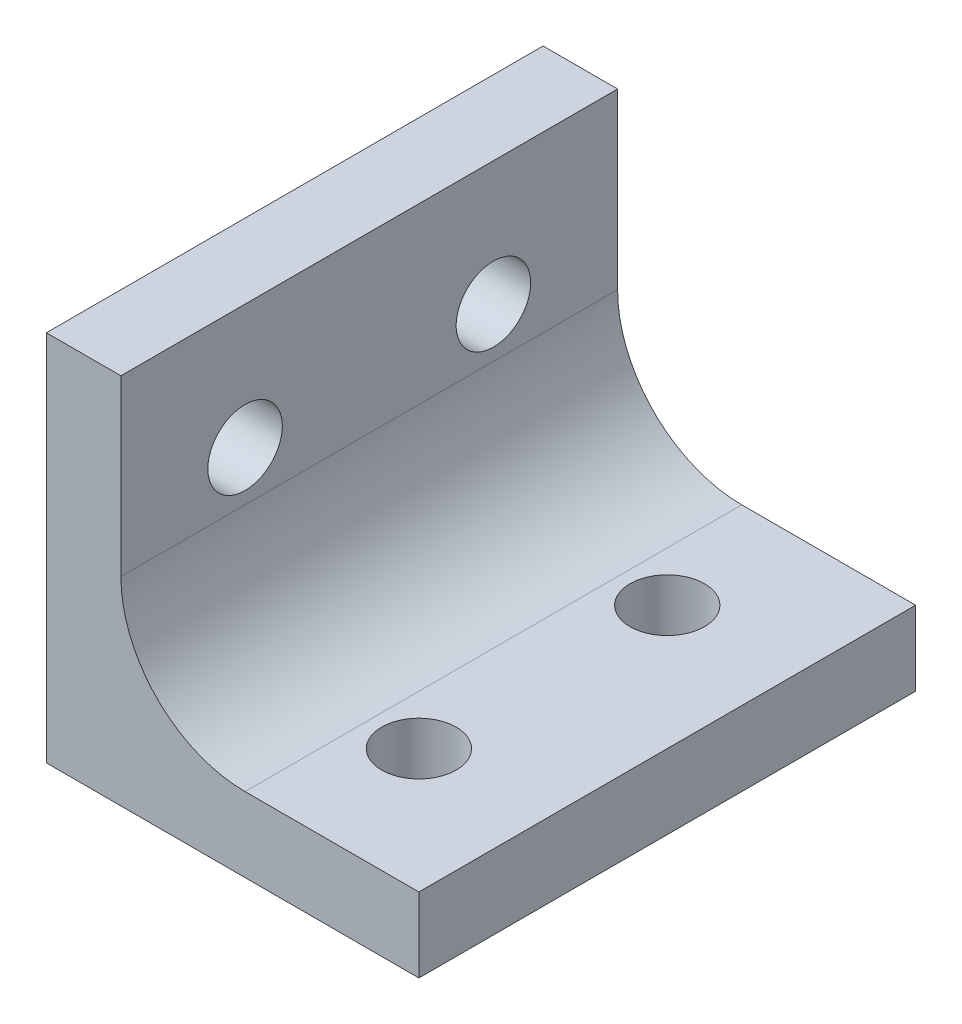
ISO-10303-21;
HEADER;
FILE_DESCRIPTION(('STEP AP214'),'2;1');
FILE_NAME('part.step','',(''),(''),'','','');
FILE_SCHEMA(('AUTOMOTIVE_DESIGN { 1 0 10303 214 1 1 1 1 }'));
ENDSEC;
DATA;
#1=APPLICATION_CONTEXT('core data for automotive mechanical design processes');
#2=APPLICATION_PROTOCOL_DEFINITION('international standard','automotive_design',2000,#1);
#3=PRODUCT_CONTEXT('',#1,'mechanical');
#4=PRODUCT('Part','Part','',(#3));
#5=PRODUCT_RELATED_PRODUCT_CATEGORY('part','',(#4));
#6=PRODUCT_DEFINITION_FORMATION('','',#4);
#7=PRODUCT_DEFINITION_CONTEXT('part definition',#1,'design');
#8=PRODUCT_DEFINITION('design','',#6,#7);
#9=PRODUCT_DEFINITION_SHAPE('','',#8);
#10=(LENGTH_UNIT() NAMED_UNIT(*) SI_UNIT(.MILLI.,.METRE.));
#11=(NAMED_UNIT(*) PLANE_ANGLE_UNIT() SI_UNIT($,.RADIAN.));
#12=(NAMED_UNIT(*) SI_UNIT($,.STERADIAN.) SOLID_ANGLE_UNIT());
#13=UNCERTAINTY_MEASURE_WITH_UNIT(LENGTH_MEASURE(1.E-05),#10,'distance_accuracy_value','');
#14=(GEOMETRIC_REPRESENTATION_CONTEXT(3) GLOBAL_UNCERTAINTY_ASSIGNED_CONTEXT((#13)) GLOBAL_UNIT_ASSIGNED_CONTEXT((#10,
#11,#12)) REPRESENTATION_CONTEXT('',''));
#15=CARTESIAN_POINT('',(0.,0.,0.));
#16=DIRECTION('',(0.,0.,1.));
#17=DIRECTION('',(1.,0.,0.));
#18=AXIS2_PLACEMENT_3D('',#15,#16,#17);
#19=CARTESIAN_POINT('',(15.,-15.,0.));
#20=DIRECTION('',(0.,0.,-1.));
#21=DIRECTION('',(-1.,0.,0.));
#22=AXIS2_PLACEMENT_3D('',#19,#20,#21);
#23=PLANE('',#22);
#24=DIRECTION('',(0.,1.,0.));
#25=VECTOR('',#24,1.);
#26=CARTESIAN_POINT('',(3.,-12.,0.));
#27=LINE('',#26,#25);
#28=CARTESIAN_POINT('',(3.,-7.,0.));
#29=VERTEX_POINT('',#28);
#30=CARTESIAN_POINT('',(3.,0.,0.));
#31=VERTEX_POINT('',#30);
#32=EDGE_CURVE('E97',#29,#31,#27,.T.);
#33=ORIENTED_EDGE('',*,*,#32,.F.);
#34=CARTESIAN_POINT('',(8.,-7.,0.));
#35=DIRECTION('',(0.,0.,-1.));
#36=DIRECTION('',(-1.,0.,0.));
#37=AXIS2_PLACEMENT_3D('',#34,#35,#36);
#38=CIRCLE('',#37,5.);
#39=CARTESIAN_POINT('',(8.,-12.,0.));
#40=VERTEX_POINT('',#39);
#41=EDGE_CURVE('E42',#29,#40,#38,.F.);
#42=ORIENTED_EDGE('',*,*,#41,.T.);
#43=DIRECTION('',(-1.,0.,0.));
#44=VECTOR('',#43,1.);
#45=CARTESIAN_POINT('',(15.,-12.,0.));
#46=LINE('',#45,#44);
#47=CARTESIAN_POINT('',(15.,-12.,0.));
#48=VERTEX_POINT('',#47);
#49=EDGE_CURVE('E134',#48,#40,#46,.T.);
#50=ORIENTED_EDGE('',*,*,#49,.F.);
#51=DIRECTION('',(0.,1.,0.));
#52=VECTOR('',#51,1.);
#53=CARTESIAN_POINT('',(15.,-15.,0.));
#54=LINE('',#53,#52);
#55=CARTESIAN_POINT('',(15.,-15.,0.));
#56=VERTEX_POINT('',#55);
#57=EDGE_CURVE('E105',#56,#48,#54,.T.);
#58=ORIENTED_EDGE('',*,*,#57,.F.);
#59=DIRECTION('',(-1.,0.,0.));
#60=VECTOR('',#59,1.);
#61=CARTESIAN_POINT('',(15.,-15.,0.));
#62=LINE('',#61,#60);
#63=CARTESIAN_POINT('',(0.,-15.,0.));
#64=VERTEX_POINT('',#63);
#65=EDGE_CURVE('E141',#56,#64,#62,.T.);
#66=ORIENTED_EDGE('',*,*,#65,.T.);
#67=DIRECTION('',(0.,1.,0.));
#68=VECTOR('',#67,1.);
#69=CARTESIAN_POINT('',(0.,-15.,0.));
#70=LINE('',#69,#68);
#71=CARTESIAN_POINT('',(0.,0.,0.));
#72=VERTEX_POINT('',#71);
#73=EDGE_CURVE('E116',#64,#72,#70,.T.);
#74=ORIENTED_EDGE('',*,*,#73,.T.);
#75=DIRECTION('',(-1.,0.,0.));
#76=VECTOR('',#75,1.);
#77=CARTESIAN_POINT('',(15.,0.,0.));
#78=LINE('',#77,#76);
#79=EDGE_CURVE('E133',#31,#72,#78,.T.);
#80=ORIENTED_EDGE('',*,*,#79,.F.);
#81=EDGE_LOOP('',(#33,#42,#50,#58,#66,#74,#80));
#82=FACE_BOUND('',#81,.T.);
#83=ADVANCED_FACE('F34',(#82),#23,.T.);
#84=CARTESIAN_POINT('',(15.,-15.,20.));
#85=DIRECTION('',(1.,0.,0.));
#86=DIRECTION('',(0.,0.,-1.));
#87=AXIS2_PLACEMENT_3D('',#84,#85,#86);
#88=PLANE('',#87);
#89=DIRECTION('',(0.,0.,-1.));
#90=VECTOR('',#89,1.);
#91=CARTESIAN_POINT('',(15.,-12.,20.));
#92=LINE('',#91,#90);
#93=CARTESIAN_POINT('',(15.,-12.,20.));
#94=VERTEX_POINT('',#93);
#95=EDGE_CURVE('E92',#94,#48,#92,.T.);
#96=ORIENTED_EDGE('',*,*,#95,.F.);
#97=DIRECTION('',(0.,1.,0.));
#98=VECTOR('',#97,1.);
#99=CARTESIAN_POINT('',(15.,-15.,20.));
#100=LINE('',#99,#98);
#101=CARTESIAN_POINT('',(15.,-15.,20.));
#102=VERTEX_POINT('',#101);
#103=EDGE_CURVE('E103',#102,#94,#100,.T.);
#104=ORIENTED_EDGE('',*,*,#103,.F.);
#105=DIRECTION('',(0.,0.,-1.));
#106=VECTOR('',#105,1.);
#107=CARTESIAN_POINT('',(15.,-15.,20.));
#108=LINE('',#107,#106);
#109=EDGE_CURVE('E122',#102,#56,#108,.T.);
#110=ORIENTED_EDGE('',*,*,#109,.T.);
#111=ORIENTED_EDGE('',*,*,#57,.T.);
#112=EDGE_LOOP('',(#96,#104,#110,#111));
#113=FACE_BOUND('',#112,.T.);
#114=ADVANCED_FACE('F101',(#113),#88,.T.);
#115=CARTESIAN_POINT('',(0.,-15.,20.));
#116=DIRECTION('',(0.,0.,1.));
#117=DIRECTION('',(1.,0.,0.));
#118=AXIS2_PLACEMENT_3D('',#115,#116,#117);
#119=PLANE('',#118);
#120=DIRECTION('',(-1.,0.,0.));
#121=VECTOR('',#120,1.);
#122=CARTESIAN_POINT('',(15.,-12.,20.));
#123=LINE('',#122,#121);
#124=CARTESIAN_POINT('',(8.,-12.,20.));
#125=VERTEX_POINT('',#124);
#126=EDGE_CURVE('E89',#94,#125,#123,.T.);
#127=ORIENTED_EDGE('',*,*,#126,.T.);
#128=CARTESIAN_POINT('',(8.,-7.,20.));
#129=DIRECTION('',(0.,0.,1.));
#130=DIRECTION('',(1.,0.,0.));
#131=AXIS2_PLACEMENT_3D('',#128,#129,#130);
#132=CIRCLE('',#131,5.);
#133=CARTESIAN_POINT('',(3.,-7.,20.));
#134=VERTEX_POINT('',#133);
#135=EDGE_CURVE('E11',#125,#134,#132,.F.);
#136=ORIENTED_EDGE('',*,*,#135,.T.);
#137=DIRECTION('',(0.,1.,0.));
#138=VECTOR('',#137,1.);
#139=CARTESIAN_POINT('',(3.,-12.,20.));
#140=LINE('',#139,#138);
#141=CARTESIAN_POINT('',(3.,0.,20.));
#142=VERTEX_POINT('',#141);
#143=EDGE_CURVE('E96',#134,#142,#140,.T.);
#144=ORIENTED_EDGE('',*,*,#143,.T.);
#145=DIRECTION('',(1.,0.,0.));
#146=VECTOR('',#145,1.);
#147=CARTESIAN_POINT('',(0.,0.,20.));
#148=LINE('',#147,#146);
#149=CARTESIAN_POINT('',(0.,0.,20.));
#150=VERTEX_POINT('',#149);
#151=EDGE_CURVE('E145',#150,#142,#148,.T.);
#152=ORIENTED_EDGE('',*,*,#151,.F.);
#153=DIRECTION('',(0.,1.,0.));
#154=VECTOR('',#153,1.);
#155=CARTESIAN_POINT('',(0.,-15.,20.));
#156=LINE('',#155,#154);
#157=CARTESIAN_POINT('',(0.,-15.,20.));
#158=VERTEX_POINT('',#157);
#159=EDGE_CURVE('E112',#158,#150,#156,.T.);
#160=ORIENTED_EDGE('',*,*,#159,.F.);
#161=DIRECTION('',(1.,0.,0.));
#162=VECTOR('',#161,1.);
#163=CARTESIAN_POINT('',(0.,-15.,20.));
#164=LINE('',#163,#162);
#165=EDGE_CURVE('E110',#158,#102,#164,.T.);
#166=ORIENTED_EDGE('',*,*,#165,.T.);
#167=ORIENTED_EDGE('',*,*,#103,.T.);
#168=EDGE_LOOP('',(#127,#136,#144,#152,#160,#166,#167));
#169=FACE_BOUND('',#168,.T.);
#170=ADVANCED_FACE('F108',(#169),#119,.T.);
#171=CARTESIAN_POINT('',(0.,-15.,0.));
#172=DIRECTION('',(-1.,0.,0.));
#173=DIRECTION('',(0.,0.,1.));
#174=AXIS2_PLACEMENT_3D('',#171,#172,#173);
#175=PLANE('',#174);
#176=CARTESIAN_POINT('',(0.,-5.,5.));
#177=DIRECTION('',(1.,0.,0.));
#178=DIRECTION('',(0.,0.,-1.));
#179=AXIS2_PLACEMENT_3D('',#176,#177,#178);
#180=CIRCLE('',#179,1.49999999999999);
#181=CARTESIAN_POINT('',(0.,-5.,3.50000000000001));
#182=VERTEX_POINT('',#181);
#183=EDGE_CURVE('E164',#182,#182,#180,.T.);
#184=ORIENTED_EDGE('',*,*,#183,.T.);
#185=EDGE_LOOP('',(#184));
#186=FACE_BOUND('',#185,.T.);
#187=CARTESIAN_POINT('',(0.,-5.,15.));
#188=DIRECTION('',(1.,0.,0.));
#189=DIRECTION('',(0.,0.,-1.));
#190=AXIS2_PLACEMENT_3D('',#187,#188,#189);
#191=CIRCLE('',#190,1.49999999999999);
#192=CARTESIAN_POINT('',(0.,-5.,13.5));
#193=VERTEX_POINT('',#192);
#194=EDGE_CURVE('E136',#193,#193,#191,.T.);
#195=ORIENTED_EDGE('',*,*,#194,.T.);
#196=EDGE_LOOP('',(#195));
#197=FACE_BOUND('',#196,.T.);
#198=DIRECTION('',(0.,0.,1.));
#199=VECTOR('',#198,1.);
#200=CARTESIAN_POINT('',(0.,0.,0.));
#201=LINE('',#200,#199);
#202=EDGE_CURVE('E151',#72,#150,#201,.T.);
#203=ORIENTED_EDGE('',*,*,#202,.F.);
#204=ORIENTED_EDGE('',*,*,#73,.F.);
#205=DIRECTION('',(0.,0.,1.));
#206=VECTOR('',#205,1.);
#207=CARTESIAN_POINT('',(0.,-15.,0.));
#208=LINE('',#207,#206);
#209=EDGE_CURVE('E144',#64,#158,#208,.T.);
#210=ORIENTED_EDGE('',*,*,#209,.T.);
#211=ORIENTED_EDGE('',*,*,#159,.T.);
#212=EDGE_LOOP('',(#203,#204,#210,#211));
#213=FACE_BOUND('',#212,.T.);
#214=ADVANCED_FACE('F211',(#186,#197,#213),#175,.T.);
#215=CARTESIAN_POINT('',(0.,-15.,0.));
#216=DIRECTION('',(0.,1.,0.));
#217=DIRECTION('',(0.,0.,1.));
#218=AXIS2_PLACEMENT_3D('',#215,#216,#217);
#219=PLANE('',#218);
#220=CARTESIAN_POINT('',(10.,-15.,5.));
#221=DIRECTION('',(0.,1.,0.));
#222=DIRECTION('',(0.,0.,1.));
#223=AXIS2_PLACEMENT_3D('',#220,#221,#222);
#224=CIRCLE('',#223,1.49999999999999);
#225=CARTESIAN_POINT('',(10.,-15.,6.49999999999999));
#226=VERTEX_POINT('',#225);
#227=EDGE_CURVE('E176',#226,#226,#224,.T.);
#228=ORIENTED_EDGE('',*,*,#227,.T.);
#229=EDGE_LOOP('',(#228));
#230=FACE_BOUND('',#229,.T.);
#231=CARTESIAN_POINT('',(10.,-15.,15.));
#232=DIRECTION('',(0.,1.,0.));
#233=DIRECTION('',(0.,0.,1.));
#234=AXIS2_PLACEMENT_3D('',#231,#232,#233);
#235=CIRCLE('',#234,1.49999999999999);
#236=CARTESIAN_POINT('',(10.,-15.,16.5));
#237=VERTEX_POINT('',#236);
#238=EDGE_CURVE('E170',#237,#237,#235,.T.);
#239=ORIENTED_EDGE('',*,*,#238,.T.);
#240=EDGE_LOOP('',(#239));
#241=FACE_BOUND('',#240,.T.);
#242=ORIENTED_EDGE('',*,*,#65,.F.);
#243=ORIENTED_EDGE('',*,*,#109,.F.);
#244=ORIENTED_EDGE('',*,*,#165,.F.);
#245=ORIENTED_EDGE('',*,*,#209,.F.);
#246=EDGE_LOOP('',(#242,#243,#244,#245));
#247=FACE_BOUND('',#246,.T.);
#248=ADVANCED_FACE('F214',(#230,#241,#247),#219,.F.);
#249=CARTESIAN_POINT('',(0.,0.,0.));
#250=DIRECTION('',(0.,1.,0.));
#251=DIRECTION('',(0.,0.,1.));
#252=AXIS2_PLACEMENT_3D('',#249,#250,#251);
#253=PLANE('',#252);
#254=DIRECTION('',(0.,0.,-1.));
#255=VECTOR('',#254,1.);
#256=CARTESIAN_POINT('',(3.,0.,20.));
#257=LINE('',#256,#255);
#258=EDGE_CURVE('E106',#142,#31,#257,.T.);
#259=ORIENTED_EDGE('',*,*,#258,.T.);
#260=ORIENTED_EDGE('',*,*,#79,.T.);
#261=ORIENTED_EDGE('',*,*,#202,.T.);
#262=ORIENTED_EDGE('',*,*,#151,.T.);
#263=EDGE_LOOP('',(#259,#260,#261,#262));
#264=FACE_BOUND('',#263,.T.);
#265=ADVANCED_FACE('F156',(#264),#253,.T.);
#266=CARTESIAN_POINT('',(3.,-12.,20.));
#267=DIRECTION('',(-1.,0.,0.));
#268=DIRECTION('',(0.,-1.,0.));
#269=AXIS2_PLACEMENT_3D('',#266,#267,#268);
#270=PLANE('',#269);
#271=CARTESIAN_POINT('',(3.,-5.,5.));
#272=DIRECTION('',(1.,0.,0.));
#273=DIRECTION('',(0.,0.,-1.));
#274=AXIS2_PLACEMENT_3D('',#271,#272,#273);
#275=CIRCLE('',#274,1.49999999999999);
#276=CARTESIAN_POINT('',(3.,-5.,3.50000000000001));
#277=VERTEX_POINT('',#276);
#278=EDGE_CURVE('E167',#277,#277,#275,.T.);
#279=ORIENTED_EDGE('',*,*,#278,.F.);
#280=EDGE_LOOP('',(#279));
#281=FACE_BOUND('',#280,.T.);
#282=CARTESIAN_POINT('',(3.,-5.,15.));
#283=DIRECTION('',(1.,0.,0.));
#284=DIRECTION('',(0.,0.,-1.));
#285=AXIS2_PLACEMENT_3D('',#282,#283,#284);
#286=CIRCLE('',#285,1.49999999999999);
#287=CARTESIAN_POINT('',(3.,-5.,13.5));
#288=VERTEX_POINT('',#287);
#289=EDGE_CURVE('E161',#288,#288,#286,.T.);
#290=ORIENTED_EDGE('',*,*,#289,.F.);
#291=EDGE_LOOP('',(#290));
#292=FACE_BOUND('',#291,.T.);
#293=ORIENTED_EDGE('',*,*,#143,.F.);
#294=DIRECTION('',(0.,0.,-1.));
#295=VECTOR('',#294,1.);
#296=CARTESIAN_POINT('',(3.,-7.,0.));
#297=LINE('',#296,#295);
#298=EDGE_CURVE('E114',#134,#29,#297,.T.);
#299=ORIENTED_EDGE('',*,*,#298,.T.);
#300=ORIENTED_EDGE('',*,*,#32,.T.);
#301=ORIENTED_EDGE('',*,*,#258,.F.);
#302=EDGE_LOOP('',(#293,#299,#300,#301));
#303=FACE_BOUND('',#302,.T.);
#304=ADVANCED_FACE('F128',(#281,#292,#303),#270,.F.);
#305=CARTESIAN_POINT('',(15.,-12.,20.));
#306=DIRECTION('',(0.,-1.,0.));
#307=DIRECTION('',(0.,0.,-1.));
#308=AXIS2_PLACEMENT_3D('',#305,#306,#307);
#309=PLANE('',#308);
#310=CARTESIAN_POINT('',(10.,-12.,5.));
#311=DIRECTION('',(0.,1.,0.));
#312=DIRECTION('',(0.,0.,1.));
#313=AXIS2_PLACEMENT_3D('',#310,#311,#312);
#314=CIRCLE('',#313,1.49999999999999);
#315=CARTESIAN_POINT('',(10.,-12.,6.49999999999999));
#316=VERTEX_POINT('',#315);
#317=EDGE_CURVE('E179',#316,#316,#314,.T.);
#318=ORIENTED_EDGE('',*,*,#317,.F.);
#319=EDGE_LOOP('',(#318));
#320=FACE_BOUND('',#319,.T.);
#321=CARTESIAN_POINT('',(10.,-12.,15.));
#322=DIRECTION('',(0.,1.,0.));
#323=DIRECTION('',(0.,0.,1.));
#324=AXIS2_PLACEMENT_3D('',#321,#322,#323);
#325=CIRCLE('',#324,1.49999999999999);
#326=CARTESIAN_POINT('',(10.,-12.,16.5));
#327=VERTEX_POINT('',#326);
#328=EDGE_CURVE('E173',#327,#327,#325,.T.);
#329=ORIENTED_EDGE('',*,*,#328,.F.);
#330=EDGE_LOOP('',(#329));
#331=FACE_BOUND('',#330,.T.);
#332=ORIENTED_EDGE('',*,*,#49,.T.);
#333=DIRECTION('',(0.,0.,-1.));
#334=VECTOR('',#333,1.);
#335=CARTESIAN_POINT('',(8.,-12.,20.));
#336=LINE('',#335,#334);
#337=EDGE_CURVE('E49',#40,#125,#336,.F.);
#338=ORIENTED_EDGE('',*,*,#337,.T.);
#339=ORIENTED_EDGE('',*,*,#126,.F.);
#340=ORIENTED_EDGE('',*,*,#95,.T.);
#341=EDGE_LOOP('',(#332,#338,#339,#340));
#342=FACE_BOUND('',#341,.T.);
#343=ADVANCED_FACE('F91',(#320,#331,#342),#309,.F.);
#344=CARTESIAN_POINT('',(3.,-5.,15.));
#345=DIRECTION('',(1.,0.,0.));
#346=DIRECTION('',(0.,0.,-1.));
#347=AXIS2_PLACEMENT_3D('',#344,#345,#346);
#348=CYLINDRICAL_SURFACE('',#347,1.49999999999999);
#349=ORIENTED_EDGE('',*,*,#194,.F.);
#350=EDGE_LOOP('',(#349));
#351=FACE_BOUND('',#350,.T.);
#352=ORIENTED_EDGE('',*,*,#289,.T.);
#353=EDGE_LOOP('',(#352));
#354=FACE_BOUND('',#353,.T.);
#355=ADVANCED_FACE('F187',(#351,#354),#348,.F.);
#356=CARTESIAN_POINT('',(3.,-5.,5.));
#357=DIRECTION('',(1.,0.,0.));
#358=DIRECTION('',(0.,0.,-1.));
#359=AXIS2_PLACEMENT_3D('',#356,#357,#358);
#360=CYLINDRICAL_SURFACE('',#359,1.49999999999999);
#361=ORIENTED_EDGE('',*,*,#183,.F.);
#362=EDGE_LOOP('',(#361));
#363=FACE_BOUND('',#362,.T.);
#364=ORIENTED_EDGE('',*,*,#278,.T.);
#365=EDGE_LOOP('',(#364));
#366=FACE_BOUND('',#365,.T.);
#367=ADVANCED_FACE('F193',(#363,#366),#360,.F.);
#368=CARTESIAN_POINT('',(10.,-12.,15.));
#369=DIRECTION('',(0.,1.,0.));
#370=DIRECTION('',(0.,0.,1.));
#371=AXIS2_PLACEMENT_3D('',#368,#369,#370);
#372=CYLINDRICAL_SURFACE('',#371,1.49999999999999);
#373=ORIENTED_EDGE('',*,*,#238,.F.);
#374=EDGE_LOOP('',(#373));
#375=FACE_BOUND('',#374,.T.);
#376=ORIENTED_EDGE('',*,*,#328,.T.);
#377=EDGE_LOOP('',(#376));
#378=FACE_BOUND('',#377,.T.);
#379=ADVANCED_FACE('F191',(#375,#378),#372,.F.);
#380=CARTESIAN_POINT('',(10.,-12.,5.));
#381=DIRECTION('',(0.,1.,0.));
#382=DIRECTION('',(0.,0.,1.));
#383=AXIS2_PLACEMENT_3D('',#380,#381,#382);
#384=CYLINDRICAL_SURFACE('',#383,1.49999999999999);
#385=ORIENTED_EDGE('',*,*,#227,.F.);
#386=EDGE_LOOP('',(#385));
#387=FACE_BOUND('',#386,.T.);
#388=ORIENTED_EDGE('',*,*,#317,.T.);
#389=EDGE_LOOP('',(#388));
#390=FACE_BOUND('',#389,.T.);
#391=ADVANCED_FACE('F183',(#387,#390),#384,.F.);
#392=CARTESIAN_POINT('',(8.,-7.,20.));
#393=DIRECTION('',(0.,0.,1.));
#394=DIRECTION('',(1.,0.,0.));
#395=AXIS2_PLACEMENT_3D('',#392,#393,#394);
#396=CYLINDRICAL_SURFACE('',#395,5.);
#397=ORIENTED_EDGE('',*,*,#135,.F.);
#398=ORIENTED_EDGE('',*,*,#337,.F.);
#399=ORIENTED_EDGE('',*,*,#41,.F.);
#400=ORIENTED_EDGE('',*,*,#298,.F.);
#401=EDGE_LOOP('',(#397,#398,#399,#400));
#402=FACE_BOUND('',#401,.T.);
#403=ADVANCED_FACE('F36',(#402),#396,.F.);
#404=CLOSED_SHELL('',(#83,#114,#170,#214,#248,#265,#304,#343,#355,#367,#379,#391,#403));
#405=MANIFOLD_SOLID_BREP('B2',#404);
#406=ADVANCED_BREP_SHAPE_REPRESENTATION('',(#18,#405),#14);
#407=SHAPE_DEFINITION_REPRESENTATION(#9,#406);
ENDSEC;
END-ISO-10303-21;
